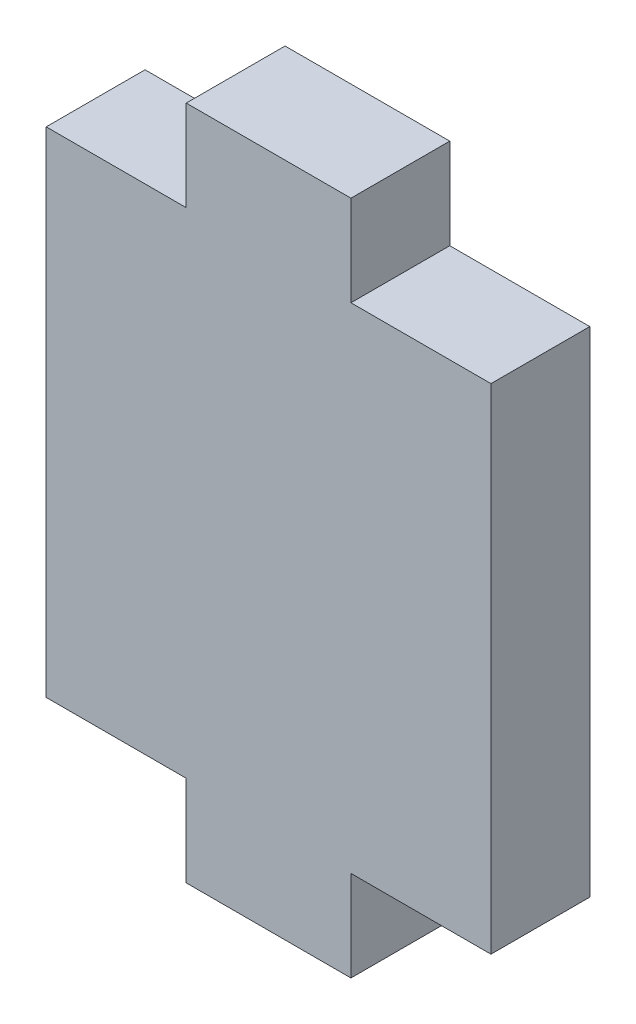
ISO-10303-21;
HEADER;
FILE_DESCRIPTION(('STEP AP214'),'2;1');
FILE_NAME('part.step','',(''),(''),'','','');
FILE_SCHEMA(('AUTOMOTIVE_DESIGN { 1 0 10303 214 1 1 1 1 }'));
ENDSEC;
DATA;
#1=APPLICATION_CONTEXT('core data for automotive mechanical design processes');
#2=APPLICATION_PROTOCOL_DEFINITION('international standard','automotive_design',2000,#1);
#3=PRODUCT_CONTEXT('',#1,'mechanical');
#4=PRODUCT('Part','Part','',(#3));
#5=PRODUCT_RELATED_PRODUCT_CATEGORY('part','',(#4));
#6=PRODUCT_DEFINITION_FORMATION('','',#4);
#7=PRODUCT_DEFINITION_CONTEXT('part definition',#1,'design');
#8=PRODUCT_DEFINITION('design','',#6,#7);
#9=PRODUCT_DEFINITION_SHAPE('','',#8);
#10=(LENGTH_UNIT() NAMED_UNIT(*) SI_UNIT(.MILLI.,.METRE.));
#11=(NAMED_UNIT(*) PLANE_ANGLE_UNIT() SI_UNIT($,.RADIAN.));
#12=(NAMED_UNIT(*) SI_UNIT($,.STERADIAN.) SOLID_ANGLE_UNIT());
#13=UNCERTAINTY_MEASURE_WITH_UNIT(LENGTH_MEASURE(1.E-05),#10,'distance_accuracy_value','');
#14=(GEOMETRIC_REPRESENTATION_CONTEXT(3) GLOBAL_UNCERTAINTY_ASSIGNED_CONTEXT((#13)) GLOBAL_UNIT_ASSIGNED_CONTEXT((#10,
#11,#12)) REPRESENTATION_CONTEXT('',''));
#15=CARTESIAN_POINT('',(0.,0.,0.));
#16=DIRECTION('',(0.,0.,1.));
#17=DIRECTION('',(1.,0.,0.));
#18=AXIS2_PLACEMENT_3D('',#15,#16,#17);
#19=CARTESIAN_POINT('',(5.,15.,6.));
#20=DIRECTION('',(0.,-1.,0.));
#21=DIRECTION('',(1.,0.,0.));
#22=AXIS2_PLACEMENT_3D('',#19,#20,#21);
#23=PLANE('',#22);
#24=DIRECTION('',(-1.,0.,0.));
#25=VECTOR('',#24,1.);
#26=CARTESIAN_POINT('',(5.,15.,0.));
#27=LINE('',#26,#25);
#28=CARTESIAN_POINT('',(13.5,15.,0.));
#29=VERTEX_POINT('',#28);
#30=CARTESIAN_POINT('',(5.,15.,0.));
#31=VERTEX_POINT('',#30);
#32=EDGE_CURVE('E153',#29,#31,#27,.T.);
#33=ORIENTED_EDGE('',*,*,#32,.T.);
#34=DIRECTION('',(0.,0.,-1.));
#35=VECTOR('',#34,1.);
#36=CARTESIAN_POINT('',(5.,15.,6.));
#37=LINE('',#36,#35);
#38=CARTESIAN_POINT('',(5.,15.,6.));
#39=VERTEX_POINT('',#38);
#40=EDGE_CURVE('E11',#39,#31,#37,.T.);
#41=ORIENTED_EDGE('',*,*,#40,.F.);
#42=DIRECTION('',(-1.,0.,0.));
#43=VECTOR('',#42,1.);
#44=CARTESIAN_POINT('',(5.,15.,6.));
#45=LINE('',#44,#43);
#46=CARTESIAN_POINT('',(13.5,15.,6.));
#47=VERTEX_POINT('',#46);
#48=EDGE_CURVE('E175',#47,#39,#45,.T.);
#49=ORIENTED_EDGE('',*,*,#48,.F.);
#50=DIRECTION('',(0.,0.,-1.));
#51=VECTOR('',#50,1.);
#52=CARTESIAN_POINT('',(13.5,15.,6.));
#53=LINE('',#52,#51);
#54=EDGE_CURVE('E149',#47,#29,#53,.T.);
#55=ORIENTED_EDGE('',*,*,#54,.T.);
#56=EDGE_LOOP('',(#33,#41,#49,#55));
#57=FACE_BOUND('',#56,.T.);
#58=ADVANCED_FACE('F33',(#57),#23,.F.);
#59=CARTESIAN_POINT('',(5.,15.,6.));
#60=DIRECTION('',(-1.,0.,0.));
#61=DIRECTION('',(0.,0.,1.));
#62=AXIS2_PLACEMENT_3D('',#59,#60,#61);
#63=PLANE('',#62);
#64=DIRECTION('',(0.,1.,0.));
#65=VECTOR('',#64,1.);
#66=CARTESIAN_POINT('',(5.,15.,0.));
#67=LINE('',#66,#65);
#68=CARTESIAN_POINT('',(5.,20.5,0.));
#69=VERTEX_POINT('',#68);
#70=EDGE_CURVE('E156',#31,#69,#67,.T.);
#71=ORIENTED_EDGE('',*,*,#70,.T.);
#72=DIRECTION('',(0.,0.,-1.));
#73=VECTOR('',#72,1.);
#74=CARTESIAN_POINT('',(5.,20.5,6.));
#75=LINE('',#74,#73);
#76=CARTESIAN_POINT('',(5.,20.5,6.));
#77=VERTEX_POINT('',#76);
#78=EDGE_CURVE('E41',#77,#69,#75,.T.);
#79=ORIENTED_EDGE('',*,*,#78,.F.);
#80=DIRECTION('',(0.,1.,0.));
#81=VECTOR('',#80,1.);
#82=CARTESIAN_POINT('',(5.,15.,6.));
#83=LINE('',#82,#81);
#84=EDGE_CURVE('E104',#39,#77,#83,.T.);
#85=ORIENTED_EDGE('',*,*,#84,.F.);
#86=ORIENTED_EDGE('',*,*,#40,.T.);
#87=EDGE_LOOP('',(#71,#79,#85,#86));
#88=FACE_BOUND('',#87,.T.);
#89=ADVANCED_FACE('F253',(#88),#63,.F.);
#90=CARTESIAN_POINT('',(5.,20.5,6.));
#91=DIRECTION('',(0.,-1.,0.));
#92=DIRECTION('',(0.,0.,-1.));
#93=AXIS2_PLACEMENT_3D('',#90,#91,#92);
#94=PLANE('',#93);
#95=DIRECTION('',(-1.,0.,0.));
#96=VECTOR('',#95,1.);
#97=CARTESIAN_POINT('',(5.,20.5,0.));
#98=LINE('',#97,#96);
#99=CARTESIAN_POINT('',(-5.,20.5,0.));
#100=VERTEX_POINT('',#99);
#101=EDGE_CURVE('E158',#69,#100,#98,.T.);
#102=ORIENTED_EDGE('',*,*,#101,.T.);
#103=DIRECTION('',(0.,0.,-1.));
#104=VECTOR('',#103,1.);
#105=CARTESIAN_POINT('',(-5.,20.5,6.));
#106=LINE('',#105,#104);
#107=CARTESIAN_POINT('',(-5.,20.5,6.));
#108=VERTEX_POINT('',#107);
#109=EDGE_CURVE('E194',#108,#100,#106,.T.);
#110=ORIENTED_EDGE('',*,*,#109,.F.);
#111=DIRECTION('',(-1.,0.,0.));
#112=VECTOR('',#111,1.);
#113=CARTESIAN_POINT('',(5.,20.5,6.));
#114=LINE('',#113,#112);
#115=EDGE_CURVE('E202',#77,#108,#114,.T.);
#116=ORIENTED_EDGE('',*,*,#115,.F.);
#117=ORIENTED_EDGE('',*,*,#78,.T.);
#118=EDGE_LOOP('',(#102,#110,#116,#117));
#119=FACE_BOUND('',#118,.T.);
#120=ADVANCED_FACE('F200',(#119),#94,.F.);
#121=CARTESIAN_POINT('',(-5.,15.,6.));
#122=DIRECTION('',(1.,0.,0.));
#123=DIRECTION('',(0.,0.,-1.));
#124=AXIS2_PLACEMENT_3D('',#121,#122,#123);
#125=PLANE('',#124);
#126=DIRECTION('',(0.,-1.,0.));
#127=VECTOR('',#126,1.);
#128=CARTESIAN_POINT('',(-5.,15.,0.));
#129=LINE('',#128,#127);
#130=CARTESIAN_POINT('',(-5.,15.,0.));
#131=VERTEX_POINT('',#130);
#132=EDGE_CURVE('E160',#100,#131,#129,.T.);
#133=ORIENTED_EDGE('',*,*,#132,.T.);
#134=DIRECTION('',(0.,0.,-1.));
#135=VECTOR('',#134,1.);
#136=CARTESIAN_POINT('',(-5.,15.,6.));
#137=LINE('',#136,#135);
#138=CARTESIAN_POINT('',(-5.,15.,6.));
#139=VERTEX_POINT('',#138);
#140=EDGE_CURVE('E191',#139,#131,#137,.T.);
#141=ORIENTED_EDGE('',*,*,#140,.F.);
#142=DIRECTION('',(0.,-1.,0.));
#143=VECTOR('',#142,1.);
#144=CARTESIAN_POINT('',(-5.,15.,6.));
#145=LINE('',#144,#143);
#146=EDGE_CURVE('E220',#108,#139,#145,.T.);
#147=ORIENTED_EDGE('',*,*,#146,.F.);
#148=ORIENTED_EDGE('',*,*,#109,.T.);
#149=EDGE_LOOP('',(#133,#141,#147,#148));
#150=FACE_BOUND('',#149,.T.);
#151=ADVANCED_FACE('F211',(#150),#125,.F.);
#152=CARTESIAN_POINT('',(-13.5,15.,6.));
#153=DIRECTION('',(0.,-1.,0.));
#154=DIRECTION('',(0.,0.,-1.));
#155=AXIS2_PLACEMENT_3D('',#152,#153,#154);
#156=PLANE('',#155);
#157=DIRECTION('',(-1.,0.,0.));
#158=VECTOR('',#157,1.);
#159=CARTESIAN_POINT('',(-13.5,15.,0.));
#160=LINE('',#159,#158);
#161=CARTESIAN_POINT('',(-13.5,15.,0.));
#162=VERTEX_POINT('',#161);
#163=EDGE_CURVE('E162',#131,#162,#160,.T.);
#164=ORIENTED_EDGE('',*,*,#163,.T.);
#165=DIRECTION('',(0.,0.,-1.));
#166=VECTOR('',#165,1.);
#167=CARTESIAN_POINT('',(-13.5,15.,6.));
#168=LINE('',#167,#166);
#169=CARTESIAN_POINT('',(-13.5,15.,6.));
#170=VERTEX_POINT('',#169);
#171=EDGE_CURVE('E188',#170,#162,#168,.T.);
#172=ORIENTED_EDGE('',*,*,#171,.F.);
#173=DIRECTION('',(-1.,0.,0.));
#174=VECTOR('',#173,1.);
#175=CARTESIAN_POINT('',(-13.5,15.,6.));
#176=LINE('',#175,#174);
#177=EDGE_CURVE('E217',#139,#170,#176,.T.);
#178=ORIENTED_EDGE('',*,*,#177,.F.);
#179=ORIENTED_EDGE('',*,*,#140,.T.);
#180=EDGE_LOOP('',(#164,#172,#178,#179));
#181=FACE_BOUND('',#180,.T.);
#182=ADVANCED_FACE('F215',(#181),#156,.F.);
#183=CARTESIAN_POINT('',(-13.5,-15.,6.));
#184=DIRECTION('',(1.,0.,0.));
#185=DIRECTION('',(0.,0.,-1.));
#186=AXIS2_PLACEMENT_3D('',#183,#184,#185);
#187=PLANE('',#186);
#188=DIRECTION('',(0.,-1.,0.));
#189=VECTOR('',#188,1.);
#190=CARTESIAN_POINT('',(-13.5,-15.,0.));
#191=LINE('',#190,#189);
#192=CARTESIAN_POINT('',(-13.5,-15.,0.));
#193=VERTEX_POINT('',#192);
#194=EDGE_CURVE('E164',#162,#193,#191,.T.);
#195=ORIENTED_EDGE('',*,*,#194,.T.);
#196=DIRECTION('',(0.,0.,-1.));
#197=VECTOR('',#196,1.);
#198=CARTESIAN_POINT('',(-13.5,-15.,6.));
#199=LINE('',#198,#197);
#200=CARTESIAN_POINT('',(-13.5,-15.,6.));
#201=VERTEX_POINT('',#200);
#202=EDGE_CURVE('E185',#201,#193,#199,.T.);
#203=ORIENTED_EDGE('',*,*,#202,.F.);
#204=DIRECTION('',(0.,-1.,0.));
#205=VECTOR('',#204,1.);
#206=CARTESIAN_POINT('',(-13.5,-15.,6.));
#207=LINE('',#206,#205);
#208=EDGE_CURVE('E219',#170,#201,#207,.T.);
#209=ORIENTED_EDGE('',*,*,#208,.F.);
#210=ORIENTED_EDGE('',*,*,#171,.T.);
#211=EDGE_LOOP('',(#195,#203,#209,#210));
#212=FACE_BOUND('',#211,.T.);
#213=ADVANCED_FACE('F266',(#212),#187,.F.);
#214=CARTESIAN_POINT('',(-13.5,-15.,6.));
#215=DIRECTION('',(0.,1.,0.));
#216=DIRECTION('',(-1.,0.,0.));
#217=AXIS2_PLACEMENT_3D('',#214,#215,#216);
#218=PLANE('',#217);
#219=DIRECTION('',(1.,0.,0.));
#220=VECTOR('',#219,1.);
#221=CARTESIAN_POINT('',(-13.5,-15.,0.));
#222=LINE('',#221,#220);
#223=CARTESIAN_POINT('',(-5.,-15.,0.));
#224=VERTEX_POINT('',#223);
#225=EDGE_CURVE('E166',#193,#224,#222,.T.);
#226=ORIENTED_EDGE('',*,*,#225,.T.);
#227=DIRECTION('',(0.,0.,-1.));
#228=VECTOR('',#227,1.);
#229=CARTESIAN_POINT('',(-5.,-15.,6.));
#230=LINE('',#229,#228);
#231=CARTESIAN_POINT('',(-5.,-15.,6.));
#232=VERTEX_POINT('',#231);
#233=EDGE_CURVE('E182',#232,#224,#230,.T.);
#234=ORIENTED_EDGE('',*,*,#233,.F.);
#235=DIRECTION('',(1.,0.,0.));
#236=VECTOR('',#235,1.);
#237=CARTESIAN_POINT('',(-13.5,-15.,6.));
#238=LINE('',#237,#236);
#239=EDGE_CURVE('E222',#201,#232,#238,.T.);
#240=ORIENTED_EDGE('',*,*,#239,.F.);
#241=ORIENTED_EDGE('',*,*,#202,.T.);
#242=EDGE_LOOP('',(#226,#234,#240,#241));
#243=FACE_BOUND('',#242,.T.);
#244=ADVANCED_FACE('F269',(#243),#218,.F.);
#245=CARTESIAN_POINT('',(-5.,-15.,6.));
#246=DIRECTION('',(1.,0.,0.));
#247=DIRECTION('',(0.,1.,0.));
#248=AXIS2_PLACEMENT_3D('',#245,#246,#247);
#249=PLANE('',#248);
#250=DIRECTION('',(0.,-1.,0.));
#251=VECTOR('',#250,1.);
#252=CARTESIAN_POINT('',(-5.,-15.,0.));
#253=LINE('',#252,#251);
#254=CARTESIAN_POINT('',(-5.,-20.5,0.));
#255=VERTEX_POINT('',#254);
#256=EDGE_CURVE('E168',#224,#255,#253,.T.);
#257=ORIENTED_EDGE('',*,*,#256,.T.);
#258=DIRECTION('',(0.,0.,-1.));
#259=VECTOR('',#258,1.);
#260=CARTESIAN_POINT('',(-5.,-20.5,6.));
#261=LINE('',#260,#259);
#262=CARTESIAN_POINT('',(-5.,-20.5,6.));
#263=VERTEX_POINT('',#262);
#264=EDGE_CURVE('E179',#263,#255,#261,.T.);
#265=ORIENTED_EDGE('',*,*,#264,.F.);
#266=DIRECTION('',(0.,-1.,0.));
#267=VECTOR('',#266,1.);
#268=CARTESIAN_POINT('',(-5.,-15.,6.));
#269=LINE('',#268,#267);
#270=EDGE_CURVE('E228',#232,#263,#269,.T.);
#271=ORIENTED_EDGE('',*,*,#270,.F.);
#272=ORIENTED_EDGE('',*,*,#233,.T.);
#273=EDGE_LOOP('',(#257,#265,#271,#272));
#274=FACE_BOUND('',#273,.T.);
#275=ADVANCED_FACE('F234',(#274),#249,.F.);
#276=CARTESIAN_POINT('',(5.,-20.5,6.));
#277=DIRECTION('',(0.,1.,0.));
#278=DIRECTION('',(0.,0.,1.));
#279=AXIS2_PLACEMENT_3D('',#276,#277,#278);
#280=PLANE('',#279);
#281=DIRECTION('',(1.,0.,0.));
#282=VECTOR('',#281,1.);
#283=CARTESIAN_POINT('',(5.,-20.5,0.));
#284=LINE('',#283,#282);
#285=CARTESIAN_POINT('',(5.,-20.5,0.));
#286=VERTEX_POINT('',#285);
#287=EDGE_CURVE('E170',#255,#286,#284,.T.);
#288=ORIENTED_EDGE('',*,*,#287,.T.);
#289=DIRECTION('',(0.,0.,-1.));
#290=VECTOR('',#289,1.);
#291=CARTESIAN_POINT('',(5.,-20.5,6.));
#292=LINE('',#291,#290);
#293=CARTESIAN_POINT('',(5.,-20.5,6.));
#294=VERTEX_POINT('',#293);
#295=EDGE_CURVE('E144',#294,#286,#292,.T.);
#296=ORIENTED_EDGE('',*,*,#295,.F.);
#297=DIRECTION('',(1.,0.,0.));
#298=VECTOR('',#297,1.);
#299=CARTESIAN_POINT('',(5.,-20.5,6.));
#300=LINE('',#299,#298);
#301=EDGE_CURVE('E135',#263,#294,#300,.T.);
#302=ORIENTED_EDGE('',*,*,#301,.F.);
#303=ORIENTED_EDGE('',*,*,#264,.T.);
#304=EDGE_LOOP('',(#288,#296,#302,#303));
#305=FACE_BOUND('',#304,.T.);
#306=ADVANCED_FACE('F238',(#305),#280,.F.);
#307=CARTESIAN_POINT('',(5.,-15.,6.));
#308=DIRECTION('',(-1.,0.,0.));
#309=DIRECTION('',(0.,-1.,0.));
#310=AXIS2_PLACEMENT_3D('',#307,#308,#309);
#311=PLANE('',#310);
#312=DIRECTION('',(0.,1.,0.));
#313=VECTOR('',#312,1.);
#314=CARTESIAN_POINT('',(5.,-15.,0.));
#315=LINE('',#314,#313);
#316=CARTESIAN_POINT('',(5.,-15.,0.));
#317=VERTEX_POINT('',#316);
#318=EDGE_CURVE('E143',#286,#317,#315,.T.);
#319=ORIENTED_EDGE('',*,*,#318,.T.);
#320=DIRECTION('',(0.,0.,-1.));
#321=VECTOR('',#320,1.);
#322=CARTESIAN_POINT('',(5.,-15.,6.));
#323=LINE('',#322,#321);
#324=CARTESIAN_POINT('',(5.,-15.,6.));
#325=VERTEX_POINT('',#324);
#326=EDGE_CURVE('E140',#325,#317,#323,.T.);
#327=ORIENTED_EDGE('',*,*,#326,.F.);
#328=DIRECTION('',(0.,1.,0.));
#329=VECTOR('',#328,1.);
#330=CARTESIAN_POINT('',(5.,-15.,6.));
#331=LINE('',#330,#329);
#332=EDGE_CURVE('E129',#294,#325,#331,.T.);
#333=ORIENTED_EDGE('',*,*,#332,.F.);
#334=ORIENTED_EDGE('',*,*,#295,.T.);
#335=EDGE_LOOP('',(#319,#327,#333,#334));
#336=FACE_BOUND('',#335,.T.);
#337=ADVANCED_FACE('F141',(#336),#311,.F.);
#338=CARTESIAN_POINT('',(5.,-15.,6.));
#339=DIRECTION('',(0.,1.,0.));
#340=DIRECTION('',(-1.,0.,0.));
#341=AXIS2_PLACEMENT_3D('',#338,#339,#340);
#342=PLANE('',#341);
#343=DIRECTION('',(1.,0.,0.));
#344=VECTOR('',#343,1.);
#345=CARTESIAN_POINT('',(5.,-15.,0.));
#346=LINE('',#345,#344);
#347=CARTESIAN_POINT('',(13.5,-15.,0.));
#348=VERTEX_POINT('',#347);
#349=EDGE_CURVE('E90',#317,#348,#346,.T.);
#350=ORIENTED_EDGE('',*,*,#349,.T.);
#351=DIRECTION('',(0.,0.,-1.));
#352=VECTOR('',#351,1.);
#353=CARTESIAN_POINT('',(13.5,-15.,6.));
#354=LINE('',#353,#352);
#355=CARTESIAN_POINT('',(13.5,-15.,6.));
#356=VERTEX_POINT('',#355);
#357=EDGE_CURVE('E145',#356,#348,#354,.T.);
#358=ORIENTED_EDGE('',*,*,#357,.F.);
#359=DIRECTION('',(1.,0.,0.));
#360=VECTOR('',#359,1.);
#361=CARTESIAN_POINT('',(5.,-15.,6.));
#362=LINE('',#361,#360);
#363=EDGE_CURVE('E133',#325,#356,#362,.T.);
#364=ORIENTED_EDGE('',*,*,#363,.F.);
#365=ORIENTED_EDGE('',*,*,#326,.T.);
#366=EDGE_LOOP('',(#350,#358,#364,#365));
#367=FACE_BOUND('',#366,.T.);
#368=ADVANCED_FACE('F147',(#367),#342,.F.);
#369=CARTESIAN_POINT('',(13.5,-15.,6.));
#370=DIRECTION('',(-1.,0.,0.));
#371=DIRECTION('',(0.,0.,1.));
#372=AXIS2_PLACEMENT_3D('',#369,#370,#371);
#373=PLANE('',#372);
#374=DIRECTION('',(0.,1.,0.));
#375=VECTOR('',#374,1.);
#376=CARTESIAN_POINT('',(13.5,-15.,0.));
#377=LINE('',#376,#375);
#378=EDGE_CURVE('E96',#348,#29,#377,.T.);
#379=ORIENTED_EDGE('',*,*,#378,.T.);
#380=ORIENTED_EDGE('',*,*,#54,.F.);
#381=DIRECTION('',(0.,1.,0.));
#382=VECTOR('',#381,1.);
#383=CARTESIAN_POINT('',(13.5,-15.,6.));
#384=LINE('',#383,#382);
#385=EDGE_CURVE('E49',#356,#47,#384,.T.);
#386=ORIENTED_EDGE('',*,*,#385,.F.);
#387=ORIENTED_EDGE('',*,*,#357,.T.);
#388=EDGE_LOOP('',(#379,#380,#386,#387));
#389=FACE_BOUND('',#388,.T.);
#390=ADVANCED_FACE('F242',(#389),#373,.F.);
#391=CARTESIAN_POINT('',(0.,0.,6.));
#392=DIRECTION('',(0.,0.,1.));
#393=DIRECTION('',(1.,0.,0.));
#394=AXIS2_PLACEMENT_3D('',#391,#392,#393);
#395=PLANE('',#394);
#396=ORIENTED_EDGE('',*,*,#48,.T.);
#397=ORIENTED_EDGE('',*,*,#84,.T.);
#398=ORIENTED_EDGE('',*,*,#115,.T.);
#399=ORIENTED_EDGE('',*,*,#146,.T.);
#400=ORIENTED_EDGE('',*,*,#177,.T.);
#401=ORIENTED_EDGE('',*,*,#208,.T.);
#402=ORIENTED_EDGE('',*,*,#239,.T.);
#403=ORIENTED_EDGE('',*,*,#270,.T.);
#404=ORIENTED_EDGE('',*,*,#301,.T.);
#405=ORIENTED_EDGE('',*,*,#332,.T.);
#406=ORIENTED_EDGE('',*,*,#363,.T.);
#407=ORIENTED_EDGE('',*,*,#385,.T.);
#408=EDGE_LOOP('',(#396,#397,#398,#399,#400,#401,#402,#403,#404,#405,#406,#407));
#409=FACE_BOUND('',#408,.T.);
#410=ADVANCED_FACE('F131',(#409),#395,.T.);
#411=CARTESIAN_POINT('',(0.,0.,0.));
#412=DIRECTION('',(0.,0.,1.));
#413=DIRECTION('',(1.,0.,0.));
#414=AXIS2_PLACEMENT_3D('',#411,#412,#413);
#415=PLANE('',#414);
#416=ORIENTED_EDGE('',*,*,#32,.F.);
#417=ORIENTED_EDGE('',*,*,#378,.F.);
#418=ORIENTED_EDGE('',*,*,#349,.F.);
#419=ORIENTED_EDGE('',*,*,#318,.F.);
#420=ORIENTED_EDGE('',*,*,#287,.F.);
#421=ORIENTED_EDGE('',*,*,#256,.F.);
#422=ORIENTED_EDGE('',*,*,#225,.F.);
#423=ORIENTED_EDGE('',*,*,#194,.F.);
#424=ORIENTED_EDGE('',*,*,#163,.F.);
#425=ORIENTED_EDGE('',*,*,#132,.F.);
#426=ORIENTED_EDGE('',*,*,#101,.F.);
#427=ORIENTED_EDGE('',*,*,#70,.F.);
#428=EDGE_LOOP('',(#416,#417,#418,#419,#420,#421,#422,#423,#424,#425,#426,#427));
#429=FACE_BOUND('',#428,.T.);
#430=ADVANCED_FACE('F206',(#429),#415,.F.);
#431=CLOSED_SHELL('',(#58,#89,#120,#151,#182,#213,#244,#275,#306,#337,#368,#390,#410,#430));
#432=MANIFOLD_SOLID_BREP('B2',#431);
#433=ADVANCED_BREP_SHAPE_REPRESENTATION('',(#18,#432),#14);
#434=SHAPE_DEFINITION_REPRESENTATION(#9,#433);
ENDSEC;
END-ISO-10303-21;
